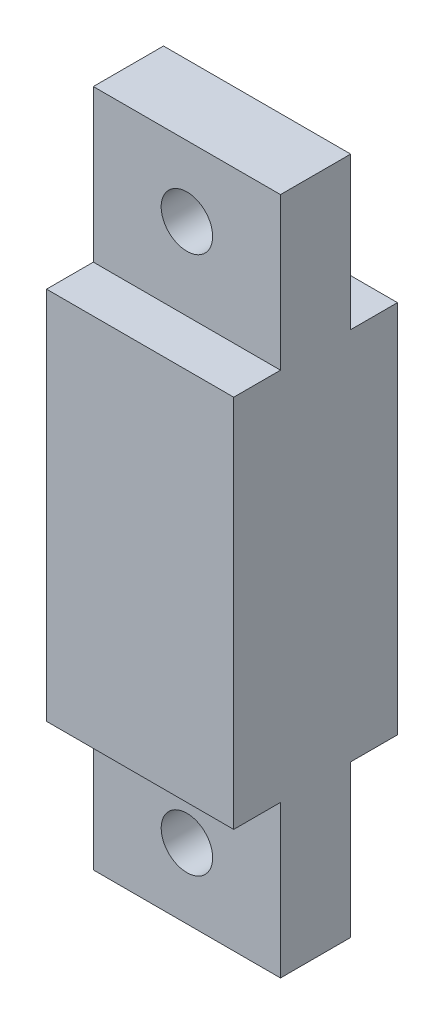
ISO-10303-21;
HEADER;
FILE_DESCRIPTION(('STEP AP214'),'2;1');
FILE_NAME('part.step','',(''),(''),'','','');
FILE_SCHEMA(('AUTOMOTIVE_DESIGN { 1 0 10303 214 1 1 1 1 }'));
ENDSEC;
DATA;
#1=APPLICATION_CONTEXT('core data for automotive mechanical design processes');
#2=APPLICATION_PROTOCOL_DEFINITION('international standard','automotive_design',2000,#1);
#3=PRODUCT_CONTEXT('',#1,'mechanical');
#4=PRODUCT('Part','Part','',(#3));
#5=PRODUCT_RELATED_PRODUCT_CATEGORY('part','',(#4));
#6=PRODUCT_DEFINITION_FORMATION('','',#4);
#7=PRODUCT_DEFINITION_CONTEXT('part definition',#1,'design');
#8=PRODUCT_DEFINITION('design','',#6,#7);
#9=PRODUCT_DEFINITION_SHAPE('','',#8);
#10=(LENGTH_UNIT() NAMED_UNIT(*) SI_UNIT(.MILLI.,.METRE.));
#11=(NAMED_UNIT(*) PLANE_ANGLE_UNIT() SI_UNIT($,.RADIAN.));
#12=(NAMED_UNIT(*) SI_UNIT($,.STERADIAN.) SOLID_ANGLE_UNIT());
#13=UNCERTAINTY_MEASURE_WITH_UNIT(LENGTH_MEASURE(1.E-05),#10,'distance_accuracy_value','');
#14=(GEOMETRIC_REPRESENTATION_CONTEXT(3) GLOBAL_UNCERTAINTY_ASSIGNED_CONTEXT((#13)) GLOBAL_UNIT_ASSIGNED_CONTEXT((#10,
#11,#12)) REPRESENTATION_CONTEXT('',''));
#15=CARTESIAN_POINT('',(0.,0.,0.));
#16=DIRECTION('',(0.,0.,1.));
#17=DIRECTION('',(1.,0.,0.));
#18=AXIS2_PLACEMENT_3D('',#15,#16,#17);
#19=CARTESIAN_POINT('',(0.,0.,3.));
#20=DIRECTION('',(0.,0.,1.));
#21=DIRECTION('',(1.,0.,0.));
#22=AXIS2_PLACEMENT_3D('',#19,#20,#21);
#23=PLANE('',#22);
#24=CARTESIAN_POINT('',(0.,-11.5,3.));
#25=DIRECTION('',(0.,0.,1.));
#26=DIRECTION('',(-1.,0.,0.));
#27=AXIS2_PLACEMENT_3D('',#24,#25,#26);
#28=CIRCLE('',#27,1.1);
#29=CARTESIAN_POINT('',(-1.1,-11.5,3.));
#30=VERTEX_POINT('',#29);
#31=EDGE_CURVE('E400',#30,#30,#28,.T.);
#32=ORIENTED_EDGE('',*,*,#31,.F.);
#33=EDGE_LOOP('',(#32));
#34=FACE_BOUND('',#33,.T.);
#35=DIRECTION('',(0.,1.,0.));
#36=VECTOR('',#35,1.);
#37=CARTESIAN_POINT('',(4.,14.5,3.));
#38=LINE('',#37,#36);
#39=CARTESIAN_POINT('',(4.,-14.5,3.));
#40=VERTEX_POINT('',#39);
#41=CARTESIAN_POINT('',(4.,-8.,3.));
#42=VERTEX_POINT('',#41);
#43=EDGE_CURVE('E186',#40,#42,#38,.T.);
#44=ORIENTED_EDGE('',*,*,#43,.T.);
#45=DIRECTION('',(-1.,0.,0.));
#46=VECTOR('',#45,1.);
#47=CARTESIAN_POINT('',(0.,-8.,3.));
#48=LINE('',#47,#46);
#49=CARTESIAN_POINT('',(-4.,-8.,3.));
#50=VERTEX_POINT('',#49);
#51=EDGE_CURVE('E128',#42,#50,#48,.T.);
#52=ORIENTED_EDGE('',*,*,#51,.T.);
#53=DIRECTION('',(0.,-1.,0.));
#54=VECTOR('',#53,1.);
#55=CARTESIAN_POINT('',(-4.,14.5,3.));
#56=LINE('',#55,#54);
#57=CARTESIAN_POINT('',(-4.,-14.5,3.));
#58=VERTEX_POINT('',#57);
#59=EDGE_CURVE('E191',#50,#58,#56,.T.);
#60=ORIENTED_EDGE('',*,*,#59,.T.);
#61=DIRECTION('',(1.,0.,0.));
#62=VECTOR('',#61,1.);
#63=CARTESIAN_POINT('',(-4.,-14.5,3.));
#64=LINE('',#63,#62);
#65=EDGE_CURVE('E195',#58,#40,#64,.T.);
#66=ORIENTED_EDGE('',*,*,#65,.T.);
#67=EDGE_LOOP('',(#44,#52,#60,#66));
#68=FACE_BOUND('',#67,.T.);
#69=ADVANCED_FACE('F32',(#34,#68),#23,.T.);
#70=CARTESIAN_POINT('',(0.,11.5,3.));
#71=DIRECTION('',(0.,0.,1.));
#72=DIRECTION('',(1.,0.,0.));
#73=AXIS2_PLACEMENT_3D('',#70,#71,#72);
#74=CIRCLE('',#73,1.1);
#75=CARTESIAN_POINT('',(1.1,11.5,3.));
#76=VERTEX_POINT('',#75);
#77=EDGE_CURVE('E399',#76,#76,#74,.T.);
#78=ORIENTED_EDGE('',*,*,#77,.F.);
#79=EDGE_LOOP('',(#78));
#80=FACE_BOUND('',#79,.T.);
#81=CARTESIAN_POINT('',(-4.,14.5,3.));
#82=VERTEX_POINT('',#81);
#83=CARTESIAN_POINT('',(-4.,8.,3.));
#84=VERTEX_POINT('',#83);
#85=EDGE_CURVE('E192',#82,#84,#56,.T.);
#86=ORIENTED_EDGE('',*,*,#85,.T.);
#87=DIRECTION('',(1.,0.,0.));
#88=VECTOR('',#87,1.);
#89=CARTESIAN_POINT('',(0.,8.,3.));
#90=LINE('',#89,#88);
#91=CARTESIAN_POINT('',(4.,8.,3.));
#92=VERTEX_POINT('',#91);
#93=EDGE_CURVE('E147',#84,#92,#90,.T.);
#94=ORIENTED_EDGE('',*,*,#93,.T.);
#95=CARTESIAN_POINT('',(4.,14.5,3.));
#96=VERTEX_POINT('',#95);
#97=EDGE_CURVE('E189',#92,#96,#38,.T.);
#98=ORIENTED_EDGE('',*,*,#97,.T.);
#99=DIRECTION('',(-1.,0.,0.));
#100=VECTOR('',#99,1.);
#101=CARTESIAN_POINT('',(-4.,14.5,3.));
#102=LINE('',#101,#100);
#103=EDGE_CURVE('E188',#96,#82,#102,.T.);
#104=ORIENTED_EDGE('',*,*,#103,.T.);
#105=EDGE_LOOP('',(#86,#94,#98,#104));
#106=FACE_BOUND('',#105,.T.);
#107=ADVANCED_FACE('F248',(#80,#106),#23,.T.);
#108=CARTESIAN_POINT('',(0.,0.,0.));
#109=DIRECTION('',(0.,0.,1.));
#110=DIRECTION('',(1.,0.,0.));
#111=AXIS2_PLACEMENT_3D('',#108,#109,#110);
#112=PLANE('',#111);
#113=CARTESIAN_POINT('',(0.,-11.5,0.));
#114=DIRECTION('',(0.,0.,1.));
#115=DIRECTION('',(1.,0.,0.));
#116=AXIS2_PLACEMENT_3D('',#113,#114,#115);
#117=CIRCLE('',#116,1.1);
#118=CARTESIAN_POINT('',(1.1,-11.5,0.));
#119=VERTEX_POINT('',#118);
#120=EDGE_CURVE('E151',#119,#119,#117,.F.);
#121=ORIENTED_EDGE('',*,*,#120,.F.);
#122=EDGE_LOOP('',(#121));
#123=FACE_BOUND('',#122,.T.);
#124=DIRECTION('',(0.,-1.,0.));
#125=VECTOR('',#124,1.);
#126=CARTESIAN_POINT('',(-4.,14.5,0.));
#127=LINE('',#126,#125);
#128=CARTESIAN_POINT('',(-4.,-8.,0.));
#129=VERTEX_POINT('',#128);
#130=CARTESIAN_POINT('',(-4.,-14.5,0.));
#131=VERTEX_POINT('',#130);
#132=EDGE_CURVE('E202',#129,#131,#127,.T.);
#133=ORIENTED_EDGE('',*,*,#132,.F.);
#134=DIRECTION('',(1.,0.,0.));
#135=VECTOR('',#134,1.);
#136=CARTESIAN_POINT('',(4.,-8.,0.));
#137=LINE('',#136,#135);
#138=CARTESIAN_POINT('',(4.,-8.,0.));
#139=VERTEX_POINT('',#138);
#140=EDGE_CURVE('E159',#129,#139,#137,.T.);
#141=ORIENTED_EDGE('',*,*,#140,.T.);
#142=DIRECTION('',(0.,1.,0.));
#143=VECTOR('',#142,1.);
#144=CARTESIAN_POINT('',(4.,14.5,0.));
#145=LINE('',#144,#143);
#146=CARTESIAN_POINT('',(4.,-14.5,0.));
#147=VERTEX_POINT('',#146);
#148=EDGE_CURVE('E198',#147,#139,#145,.T.);
#149=ORIENTED_EDGE('',*,*,#148,.F.);
#150=DIRECTION('',(1.,0.,0.));
#151=VECTOR('',#150,1.);
#152=CARTESIAN_POINT('',(-4.,-14.5,0.));
#153=LINE('',#152,#151);
#154=EDGE_CURVE('E206',#131,#147,#153,.T.);
#155=ORIENTED_EDGE('',*,*,#154,.F.);
#156=EDGE_LOOP('',(#133,#141,#149,#155));
#157=FACE_BOUND('',#156,.T.);
#158=ADVANCED_FACE('F239',(#123,#157),#112,.F.);
#159=CARTESIAN_POINT('',(4.,14.5,3.));
#160=DIRECTION('',(-1.,0.,0.));
#161=DIRECTION('',(0.,-1.,0.));
#162=AXIS2_PLACEMENT_3D('',#159,#160,#161);
#163=PLANE('',#162);
#164=ORIENTED_EDGE('',*,*,#148,.T.);
#165=DIRECTION('',(0.,0.,1.));
#166=VECTOR('',#165,1.);
#167=CARTESIAN_POINT('',(4.,-8.,-2.));
#168=LINE('',#167,#166);
#169=CARTESIAN_POINT('',(4.,-8.,-2.));
#170=VERTEX_POINT('',#169);
#171=EDGE_CURVE('E183',#170,#139,#168,.T.);
#172=ORIENTED_EDGE('',*,*,#171,.F.);
#173=DIRECTION('',(0.,1.,0.));
#174=VECTOR('',#173,1.);
#175=CARTESIAN_POINT('',(4.,8.,-2.));
#176=LINE('',#175,#174);
#177=CARTESIAN_POINT('',(4.,8.,-2.));
#178=VERTEX_POINT('',#177);
#179=EDGE_CURVE('E170',#170,#178,#176,.T.);
#180=ORIENTED_EDGE('',*,*,#179,.T.);
#181=DIRECTION('',(0.,0.,1.));
#182=VECTOR('',#181,1.);
#183=CARTESIAN_POINT('',(4.,8.,-2.));
#184=LINE('',#183,#182);
#185=CARTESIAN_POINT('',(4.,8.,0.));
#186=VERTEX_POINT('',#185);
#187=EDGE_CURVE('E181',#178,#186,#184,.T.);
#188=ORIENTED_EDGE('',*,*,#187,.T.);
#189=CARTESIAN_POINT('',(4.,14.5,0.));
#190=VERTEX_POINT('',#189);
#191=EDGE_CURVE('E180',#186,#190,#145,.T.);
#192=ORIENTED_EDGE('',*,*,#191,.T.);
#193=DIRECTION('',(0.,0.,-1.));
#194=VECTOR('',#193,1.);
#195=CARTESIAN_POINT('',(4.,14.5,3.));
#196=LINE('',#195,#194);
#197=EDGE_CURVE('E11',#96,#190,#196,.T.);
#198=ORIENTED_EDGE('',*,*,#197,.F.);
#199=ORIENTED_EDGE('',*,*,#97,.F.);
#200=DIRECTION('',(0.,0.,-1.));
#201=VECTOR('',#200,1.);
#202=CARTESIAN_POINT('',(4.,8.,5.));
#203=LINE('',#202,#201);
#204=CARTESIAN_POINT('',(4.,8.,5.));
#205=VERTEX_POINT('',#204);
#206=EDGE_CURVE('E47',#205,#92,#203,.T.);
#207=ORIENTED_EDGE('',*,*,#206,.F.);
#208=DIRECTION('',(0.,-1.,0.));
#209=VECTOR('',#208,1.);
#210=CARTESIAN_POINT('',(4.,0.,5.));
#211=LINE('',#210,#209);
#212=CARTESIAN_POINT('',(4.,-8.,5.));
#213=VERTEX_POINT('',#212);
#214=EDGE_CURVE('E141',#205,#213,#211,.T.);
#215=ORIENTED_EDGE('',*,*,#214,.T.);
#216=DIRECTION('',(0.,0.,-1.));
#217=VECTOR('',#216,1.);
#218=CARTESIAN_POINT('',(4.,-8.,5.));
#219=LINE('',#218,#217);
#220=EDGE_CURVE('E123',#213,#42,#219,.T.);
#221=ORIENTED_EDGE('',*,*,#220,.T.);
#222=ORIENTED_EDGE('',*,*,#43,.F.);
#223=DIRECTION('',(0.,0.,-1.));
#224=VECTOR('',#223,1.);
#225=CARTESIAN_POINT('',(4.,-14.5,3.));
#226=LINE('',#225,#224);
#227=EDGE_CURVE('E197',#40,#147,#226,.T.);
#228=ORIENTED_EDGE('',*,*,#227,.T.);
#229=EDGE_LOOP('',(#164,#172,#180,#188,#192,#198,#199,#207,#215,#221,#222,#228));
#230=FACE_BOUND('',#229,.T.);
#231=ADVANCED_FACE('F34',(#230),#163,.F.);
#232=CARTESIAN_POINT('',(-4.,14.5,3.));
#233=DIRECTION('',(0.,-1.,0.));
#234=DIRECTION('',(0.,0.,-1.));
#235=AXIS2_PLACEMENT_3D('',#232,#233,#234);
#236=PLANE('',#235);
#237=DIRECTION('',(-1.,0.,0.));
#238=VECTOR('',#237,1.);
#239=CARTESIAN_POINT('',(-4.,14.5,0.));
#240=LINE('',#239,#238);
#241=CARTESIAN_POINT('',(-4.,14.5,0.));
#242=VERTEX_POINT('',#241);
#243=EDGE_CURVE('E200',#190,#242,#240,.T.);
#244=ORIENTED_EDGE('',*,*,#243,.T.);
#245=DIRECTION('',(0.,0.,-1.));
#246=VECTOR('',#245,1.);
#247=CARTESIAN_POINT('',(-4.,14.5,3.));
#248=LINE('',#247,#246);
#249=EDGE_CURVE('E40',#82,#242,#248,.T.);
#250=ORIENTED_EDGE('',*,*,#249,.F.);
#251=ORIENTED_EDGE('',*,*,#103,.F.);
#252=ORIENTED_EDGE('',*,*,#197,.T.);
#253=EDGE_LOOP('',(#244,#250,#251,#252));
#254=FACE_BOUND('',#253,.T.);
#255=ADVANCED_FACE('F250',(#254),#236,.F.);
#256=CARTESIAN_POINT('',(-4.,14.5,3.));
#257=DIRECTION('',(1.,0.,0.));
#258=DIRECTION('',(0.,1.,0.));
#259=AXIS2_PLACEMENT_3D('',#256,#257,#258);
#260=PLANE('',#259);
#261=CARTESIAN_POINT('',(-4.,8.,0.));
#262=VERTEX_POINT('',#261);
#263=EDGE_CURVE('E203',#242,#262,#127,.T.);
#264=ORIENTED_EDGE('',*,*,#263,.T.);
#265=DIRECTION('',(0.,0.,1.));
#266=VECTOR('',#265,1.);
#267=CARTESIAN_POINT('',(-4.,8.,-2.));
#268=LINE('',#267,#266);
#269=CARTESIAN_POINT('',(-4.,8.,-2.));
#270=VERTEX_POINT('',#269);
#271=EDGE_CURVE('E55',#270,#262,#268,.T.);
#272=ORIENTED_EDGE('',*,*,#271,.F.);
#273=DIRECTION('',(0.,-1.,0.));
#274=VECTOR('',#273,1.);
#275=CARTESIAN_POINT('',(-4.,8.,-2.));
#276=LINE('',#275,#274);
#277=CARTESIAN_POINT('',(-4.,-8.,-2.));
#278=VERTEX_POINT('',#277);
#279=EDGE_CURVE('E163',#270,#278,#276,.T.);
#280=ORIENTED_EDGE('',*,*,#279,.T.);
#281=DIRECTION('',(0.,0.,1.));
#282=VECTOR('',#281,1.);
#283=CARTESIAN_POINT('',(-4.,-8.,-2.));
#284=LINE('',#283,#282);
#285=EDGE_CURVE('E175',#278,#129,#284,.T.);
#286=ORIENTED_EDGE('',*,*,#285,.T.);
#287=ORIENTED_EDGE('',*,*,#132,.T.);
#288=DIRECTION('',(0.,0.,-1.));
#289=VECTOR('',#288,1.);
#290=CARTESIAN_POINT('',(-4.,-14.5,3.));
#291=LINE('',#290,#289);
#292=EDGE_CURVE('E210',#58,#131,#291,.T.);
#293=ORIENTED_EDGE('',*,*,#292,.F.);
#294=ORIENTED_EDGE('',*,*,#59,.F.);
#295=DIRECTION('',(0.,0.,-1.));
#296=VECTOR('',#295,1.);
#297=CARTESIAN_POINT('',(-4.,-8.,5.));
#298=LINE('',#297,#296);
#299=CARTESIAN_POINT('',(-4.,-8.,5.));
#300=VERTEX_POINT('',#299);
#301=EDGE_CURVE('E133',#300,#50,#298,.T.);
#302=ORIENTED_EDGE('',*,*,#301,.F.);
#303=DIRECTION('',(0.,1.,0.));
#304=VECTOR('',#303,1.);
#305=CARTESIAN_POINT('',(-4.,0.,5.));
#306=LINE('',#305,#304);
#307=CARTESIAN_POINT('',(-4.,8.,5.));
#308=VERTEX_POINT('',#307);
#309=EDGE_CURVE('E143',#300,#308,#306,.T.);
#310=ORIENTED_EDGE('',*,*,#309,.T.);
#311=DIRECTION('',(0.,0.,-1.));
#312=VECTOR('',#311,1.);
#313=CARTESIAN_POINT('',(-4.,8.,5.));
#314=LINE('',#313,#312);
#315=EDGE_CURVE('E160',#308,#84,#314,.T.);
#316=ORIENTED_EDGE('',*,*,#315,.T.);
#317=ORIENTED_EDGE('',*,*,#85,.F.);
#318=ORIENTED_EDGE('',*,*,#249,.T.);
#319=EDGE_LOOP('',(#264,#272,#280,#286,#287,#293,#294,#302,#310,#316,#317,#318));
#320=FACE_BOUND('',#319,.T.);
#321=ADVANCED_FACE('F217',(#320),#260,.F.);
#322=CARTESIAN_POINT('',(-4.,-14.5,3.));
#323=DIRECTION('',(0.,1.,0.));
#324=DIRECTION('',(0.,0.,1.));
#325=AXIS2_PLACEMENT_3D('',#322,#323,#324);
#326=PLANE('',#325);
#327=ORIENTED_EDGE('',*,*,#154,.T.);
#328=ORIENTED_EDGE('',*,*,#227,.F.);
#329=ORIENTED_EDGE('',*,*,#65,.F.);
#330=ORIENTED_EDGE('',*,*,#292,.T.);
#331=EDGE_LOOP('',(#327,#328,#329,#330));
#332=FACE_BOUND('',#331,.T.);
#333=ADVANCED_FACE('F242',(#332),#326,.F.);
#334=CARTESIAN_POINT('',(0.,11.5,0.));
#335=DIRECTION('',(0.,0.,1.));
#336=DIRECTION('',(1.,0.,0.));
#337=AXIS2_PLACEMENT_3D('',#334,#335,#336);
#338=CIRCLE('',#337,1.1);
#339=CARTESIAN_POINT('',(1.1,11.5,0.));
#340=VERTEX_POINT('',#339);
#341=EDGE_CURVE('E156',#340,#340,#338,.F.);
#342=ORIENTED_EDGE('',*,*,#341,.F.);
#343=EDGE_LOOP('',(#342));
#344=FACE_BOUND('',#343,.T.);
#345=ORIENTED_EDGE('',*,*,#191,.F.);
#346=DIRECTION('',(-1.,0.,0.));
#347=VECTOR('',#346,1.);
#348=CARTESIAN_POINT('',(4.,8.,0.));
#349=LINE('',#348,#347);
#350=EDGE_CURVE('E167',#186,#262,#349,.T.);
#351=ORIENTED_EDGE('',*,*,#350,.T.);
#352=ORIENTED_EDGE('',*,*,#263,.F.);
#353=ORIENTED_EDGE('',*,*,#243,.F.);
#354=EDGE_LOOP('',(#345,#351,#352,#353));
#355=FACE_BOUND('',#354,.T.);
#356=ADVANCED_FACE('F223',(#344,#355),#112,.F.);
#357=CARTESIAN_POINT('',(4.,8.,-2.));
#358=DIRECTION('',(0.,1.,0.));
#359=DIRECTION('',(0.,0.,1.));
#360=AXIS2_PLACEMENT_3D('',#357,#358,#359);
#361=PLANE('',#360);
#362=ORIENTED_EDGE('',*,*,#350,.F.);
#363=ORIENTED_EDGE('',*,*,#187,.F.);
#364=DIRECTION('',(-1.,0.,0.));
#365=VECTOR('',#364,1.);
#366=CARTESIAN_POINT('',(4.,8.,-2.));
#367=LINE('',#366,#365);
#368=EDGE_CURVE('E173',#178,#270,#367,.T.);
#369=ORIENTED_EDGE('',*,*,#368,.T.);
#370=ORIENTED_EDGE('',*,*,#271,.T.);
#371=EDGE_LOOP('',(#362,#363,#369,#370));
#372=FACE_BOUND('',#371,.T.);
#373=ADVANCED_FACE('F224',(#372),#361,.T.);
#374=CARTESIAN_POINT('',(4.,-8.,-2.));
#375=DIRECTION('',(0.,-1.,0.));
#376=DIRECTION('',(0.,0.,-1.));
#377=AXIS2_PLACEMENT_3D('',#374,#375,#376);
#378=PLANE('',#377);
#379=ORIENTED_EDGE('',*,*,#140,.F.);
#380=ORIENTED_EDGE('',*,*,#285,.F.);
#381=DIRECTION('',(1.,0.,0.));
#382=VECTOR('',#381,1.);
#383=CARTESIAN_POINT('',(4.,-8.,-2.));
#384=LINE('',#383,#382);
#385=EDGE_CURVE('E166',#278,#170,#384,.T.);
#386=ORIENTED_EDGE('',*,*,#385,.T.);
#387=ORIENTED_EDGE('',*,*,#171,.T.);
#388=EDGE_LOOP('',(#379,#380,#386,#387));
#389=FACE_BOUND('',#388,.T.);
#390=ADVANCED_FACE('F235',(#389),#378,.T.);
#391=CARTESIAN_POINT('',(0.,0.,-2.));
#392=DIRECTION('',(0.,0.,-1.));
#393=DIRECTION('',(-1.,0.,0.));
#394=AXIS2_PLACEMENT_3D('',#391,#392,#393);
#395=PLANE('',#394);
#396=ORIENTED_EDGE('',*,*,#279,.F.);
#397=ORIENTED_EDGE('',*,*,#368,.F.);
#398=ORIENTED_EDGE('',*,*,#179,.F.);
#399=ORIENTED_EDGE('',*,*,#385,.F.);
#400=EDGE_LOOP('',(#396,#397,#398,#399));
#401=FACE_BOUND('',#400,.T.);
#402=ADVANCED_FACE('F230',(#401),#395,.T.);
#403=CARTESIAN_POINT('',(0.,8.,5.));
#404=DIRECTION('',(0.,1.,0.));
#405=DIRECTION('',(0.,0.,1.));
#406=AXIS2_PLACEMENT_3D('',#403,#404,#405);
#407=PLANE('',#406);
#408=ORIENTED_EDGE('',*,*,#93,.F.);
#409=ORIENTED_EDGE('',*,*,#315,.F.);
#410=DIRECTION('',(1.,0.,0.));
#411=VECTOR('',#410,1.);
#412=CARTESIAN_POINT('',(0.,8.,5.));
#413=LINE('',#412,#411);
#414=EDGE_CURVE('E134',#308,#205,#413,.T.);
#415=ORIENTED_EDGE('',*,*,#414,.T.);
#416=ORIENTED_EDGE('',*,*,#206,.T.);
#417=EDGE_LOOP('',(#408,#409,#415,#416));
#418=FACE_BOUND('',#417,.T.);
#419=ADVANCED_FACE('F246',(#418),#407,.T.);
#420=CARTESIAN_POINT('',(0.,-8.,5.));
#421=DIRECTION('',(0.,-1.,0.));
#422=DIRECTION('',(0.,0.,-1.));
#423=AXIS2_PLACEMENT_3D('',#420,#421,#422);
#424=PLANE('',#423);
#425=ORIENTED_EDGE('',*,*,#51,.F.);
#426=ORIENTED_EDGE('',*,*,#220,.F.);
#427=DIRECTION('',(-1.,0.,0.));
#428=VECTOR('',#427,1.);
#429=CARTESIAN_POINT('',(0.,-8.,5.));
#430=LINE('',#429,#428);
#431=EDGE_CURVE('E126',#213,#300,#430,.T.);
#432=ORIENTED_EDGE('',*,*,#431,.T.);
#433=ORIENTED_EDGE('',*,*,#301,.T.);
#434=EDGE_LOOP('',(#425,#426,#432,#433));
#435=FACE_BOUND('',#434,.T.);
#436=ADVANCED_FACE('F125',(#435),#424,.T.);
#437=CARTESIAN_POINT('',(0.,0.,5.));
#438=DIRECTION('',(0.,0.,-1.));
#439=DIRECTION('',(-1.,0.,0.));
#440=AXIS2_PLACEMENT_3D('',#437,#438,#439);
#441=PLANE('',#440);
#442=ORIENTED_EDGE('',*,*,#214,.F.);
#443=ORIENTED_EDGE('',*,*,#414,.F.);
#444=ORIENTED_EDGE('',*,*,#309,.F.);
#445=ORIENTED_EDGE('',*,*,#431,.F.);
#446=EDGE_LOOP('',(#442,#443,#444,#445));
#447=FACE_BOUND('',#446,.T.);
#448=ADVANCED_FACE('F139',(#447),#441,.F.);
#449=CARTESIAN_POINT('',(0.,11.5,-2.001));
#450=DIRECTION('',(0.,0.,1.));
#451=DIRECTION('',(1.,0.,0.));
#452=AXIS2_PLACEMENT_3D('',#449,#450,#451);
#453=CYLINDRICAL_SURFACE('',#452,1.1);
#454=ORIENTED_EDGE('',*,*,#77,.T.);
#455=EDGE_LOOP('',(#454));
#456=FACE_BOUND('',#455,.T.);
#457=ORIENTED_EDGE('',*,*,#341,.T.);
#458=EDGE_LOOP('',(#457));
#459=FACE_BOUND('',#458,.T.);
#460=ADVANCED_FACE('F317',(#456,#459),#453,.F.);
#461=CARTESIAN_POINT('',(0.,-11.5,-2.001));
#462=DIRECTION('',(0.,0.,1.));
#463=DIRECTION('',(1.,0.,0.));
#464=AXIS2_PLACEMENT_3D('',#461,#462,#463);
#465=CYLINDRICAL_SURFACE('',#464,1.1);
#466=ORIENTED_EDGE('',*,*,#31,.T.);
#467=EDGE_LOOP('',(#466));
#468=FACE_BOUND('',#467,.T.);
#469=ORIENTED_EDGE('',*,*,#120,.T.);
#470=EDGE_LOOP('',(#469));
#471=FACE_BOUND('',#470,.T.);
#472=ADVANCED_FACE('F323',(#468,#471),#465,.F.);
#473=CLOSED_SHELL('',(#69,#107,#158,#231,#255,#321,#333,#356,#373,#390,#402,#419,#436,#448,#460,#472));
#474=MANIFOLD_SOLID_BREP('B2',#473);
#475=ADVANCED_BREP_SHAPE_REPRESENTATION('',(#18,#474),#14);
#476=SHAPE_DEFINITION_REPRESENTATION(#9,#475);
ENDSEC;
END-ISO-10303-21;
